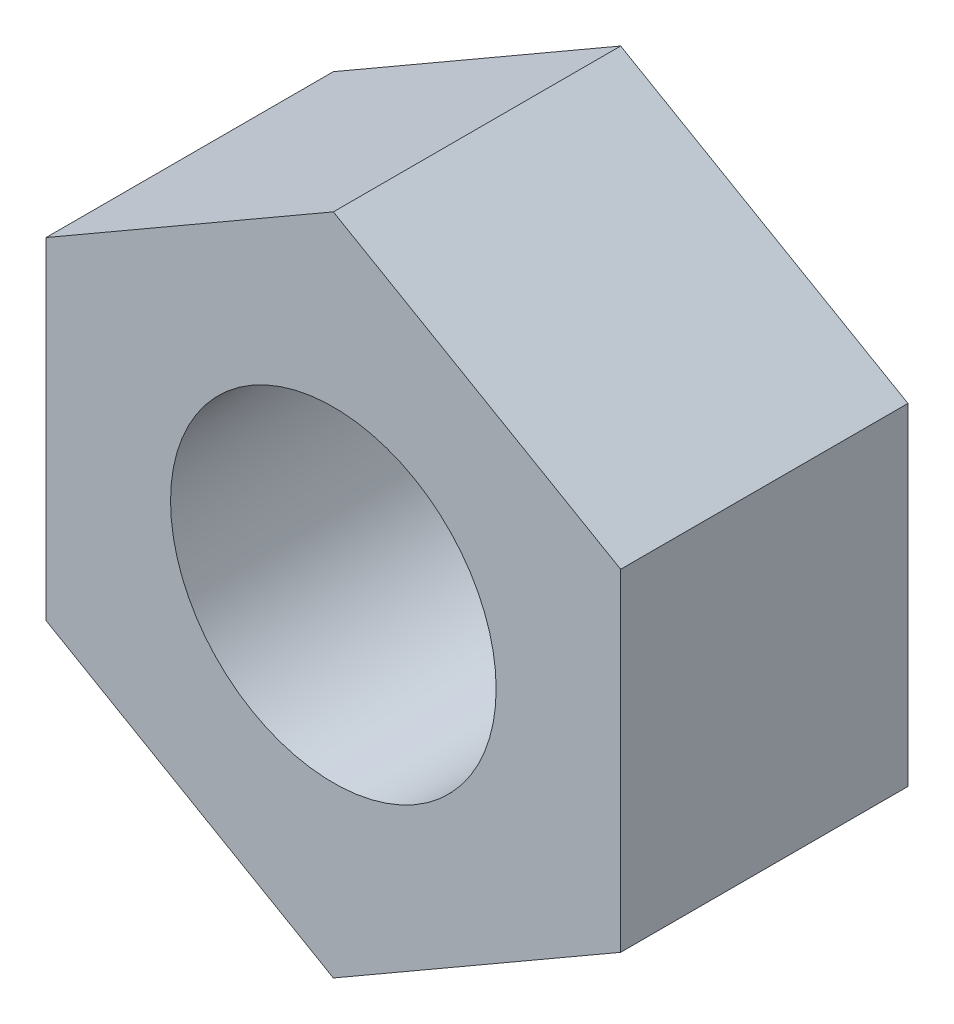
ISO-10303-21;
HEADER;
FILE_DESCRIPTION(('STEP AP214'),'2;1');
FILE_NAME('part.step','',(''),(''),'','','');
FILE_SCHEMA(('AUTOMOTIVE_DESIGN { 1 0 10303 214 1 1 1 1 }'));
ENDSEC;
DATA;
#1=APPLICATION_CONTEXT('core data for automotive mechanical design processes');
#2=APPLICATION_PROTOCOL_DEFINITION('international standard','automotive_design',2000,#1);
#3=PRODUCT_CONTEXT('',#1,'mechanical');
#4=PRODUCT('Part','Part','',(#3));
#5=PRODUCT_RELATED_PRODUCT_CATEGORY('part','',(#4));
#6=PRODUCT_DEFINITION_FORMATION('','',#4);
#7=PRODUCT_DEFINITION_CONTEXT('part definition',#1,'design');
#8=PRODUCT_DEFINITION('design','',#6,#7);
#9=PRODUCT_DEFINITION_SHAPE('','',#8);
#10=(LENGTH_UNIT() NAMED_UNIT(*) SI_UNIT(.MILLI.,.METRE.));
#11=(NAMED_UNIT(*) PLANE_ANGLE_UNIT() SI_UNIT($,.RADIAN.));
#12=(NAMED_UNIT(*) SI_UNIT($,.STERADIAN.) SOLID_ANGLE_UNIT());
#13=UNCERTAINTY_MEASURE_WITH_UNIT(LENGTH_MEASURE(1.E-05),#10,'distance_accuracy_value','');
#14=(GEOMETRIC_REPRESENTATION_CONTEXT(3) GLOBAL_UNCERTAINTY_ASSIGNED_CONTEXT((#13)) GLOBAL_UNIT_ASSIGNED_CONTEXT((#10,
#11,#12)) REPRESENTATION_CONTEXT('',''));
#15=CARTESIAN_POINT('',(0.,0.,0.));
#16=DIRECTION('',(0.,0.,1.));
#17=DIRECTION('',(1.,0.,0.));
#18=AXIS2_PLACEMENT_3D('',#15,#16,#17);
#19=CARTESIAN_POINT('',(0.,-6.92820323027551,6.));
#20=DIRECTION('',(-0.5,0.866025403784439,0.));
#21=DIRECTION('',(-0.866025403784439,-0.5,0.));
#22=AXIS2_PLACEMENT_3D('',#19,#20,#21);
#23=PLANE('',#22);
#24=DIRECTION('',(0.866025403784438,0.5,0.));
#25=VECTOR('',#24,1.);
#26=CARTESIAN_POINT('',(0.,-6.92820323027551,0.));
#27=LINE('',#26,#25);
#28=CARTESIAN_POINT('',(0.,-6.92820323027551,0.));
#29=VERTEX_POINT('',#28);
#30=CARTESIAN_POINT('',(6.,-3.46410161513775,0.));
#31=VERTEX_POINT('',#30);
#32=EDGE_CURVE('E138',#29,#31,#27,.T.);
#33=ORIENTED_EDGE('',*,*,#32,.T.);
#34=DIRECTION('',(0.,0.,-1.));
#35=VECTOR('',#34,1.);
#36=CARTESIAN_POINT('',(6.,-3.46410161513775,6.));
#37=LINE('',#36,#35);
#38=CARTESIAN_POINT('',(6.,-3.46410161513775,6.));
#39=VERTEX_POINT('',#38);
#40=EDGE_CURVE('E11',#39,#31,#37,.T.);
#41=ORIENTED_EDGE('',*,*,#40,.F.);
#42=DIRECTION('',(0.866025403784438,0.5,0.));
#43=VECTOR('',#42,1.);
#44=CARTESIAN_POINT('',(0.,-6.92820323027551,6.));
#45=LINE('',#44,#43);
#46=CARTESIAN_POINT('',(0.,-6.92820323027551,6.));
#47=VERTEX_POINT('',#46);
#48=EDGE_CURVE('E155',#47,#39,#45,.T.);
#49=ORIENTED_EDGE('',*,*,#48,.F.);
#50=DIRECTION('',(0.,0.,-1.));
#51=VECTOR('',#50,1.);
#52=CARTESIAN_POINT('',(0.,-6.92820323027551,6.));
#53=LINE('',#52,#51);
#54=EDGE_CURVE('E134',#47,#29,#53,.T.);
#55=ORIENTED_EDGE('',*,*,#54,.T.);
#56=EDGE_LOOP('',(#33,#41,#49,#55));
#57=FACE_BOUND('',#56,.T.);
#58=ADVANCED_FACE('F49',(#57),#23,.F.);
#59=CARTESIAN_POINT('',(6.,-3.46410161513775,6.));
#60=DIRECTION('',(-1.,0.,0.));
#61=DIRECTION('',(0.,0.,1.));
#62=AXIS2_PLACEMENT_3D('',#59,#60,#61);
#63=PLANE('',#62);
#64=DIRECTION('',(0.,1.,0.));
#65=VECTOR('',#64,1.);
#66=CARTESIAN_POINT('',(6.,-3.46410161513775,0.));
#67=LINE('',#66,#65);
#68=CARTESIAN_POINT('',(6.,3.46410161513776,0.));
#69=VERTEX_POINT('',#68);
#70=EDGE_CURVE('E142',#31,#69,#67,.T.);
#71=ORIENTED_EDGE('',*,*,#70,.T.);
#72=DIRECTION('',(0.,0.,-1.));
#73=VECTOR('',#72,1.);
#74=CARTESIAN_POINT('',(6.,3.46410161513776,6.));
#75=LINE('',#74,#73);
#76=CARTESIAN_POINT('',(6.,3.46410161513776,6.));
#77=VERTEX_POINT('',#76);
#78=EDGE_CURVE('E58',#77,#69,#75,.T.);
#79=ORIENTED_EDGE('',*,*,#78,.F.);
#80=DIRECTION('',(0.,1.,0.));
#81=VECTOR('',#80,1.);
#82=CARTESIAN_POINT('',(6.,-3.46410161513775,6.));
#83=LINE('',#82,#81);
#84=EDGE_CURVE('E103',#39,#77,#83,.T.);
#85=ORIENTED_EDGE('',*,*,#84,.F.);
#86=ORIENTED_EDGE('',*,*,#40,.T.);
#87=EDGE_LOOP('',(#71,#79,#85,#86));
#88=FACE_BOUND('',#87,.T.);
#89=ADVANCED_FACE('F185',(#88),#63,.F.);
#90=CARTESIAN_POINT('',(6.,3.46410161513776,6.));
#91=DIRECTION('',(-0.5,-0.866025403784439,0.));
#92=DIRECTION('',(0.866025403784439,-0.5,0.));
#93=AXIS2_PLACEMENT_3D('',#90,#91,#92);
#94=PLANE('',#93);
#95=DIRECTION('',(-0.866025403784439,0.5,0.));
#96=VECTOR('',#95,1.);
#97=CARTESIAN_POINT('',(6.,3.46410161513776,0.));
#98=LINE('',#97,#96);
#99=CARTESIAN_POINT('',(0.,6.92820323027551,0.));
#100=VERTEX_POINT('',#99);
#101=EDGE_CURVE('E146',#69,#100,#98,.T.);
#102=ORIENTED_EDGE('',*,*,#101,.T.);
#103=DIRECTION('',(0.,0.,-1.));
#104=VECTOR('',#103,1.);
#105=CARTESIAN_POINT('',(0.,6.92820323027551,6.));
#106=LINE('',#105,#104);
#107=CARTESIAN_POINT('',(0.,6.92820323027551,6.));
#108=VERTEX_POINT('',#107);
#109=EDGE_CURVE('E127',#108,#100,#106,.T.);
#110=ORIENTED_EDGE('',*,*,#109,.F.);
#111=DIRECTION('',(-0.866025403784439,0.5,0.));
#112=VECTOR('',#111,1.);
#113=CARTESIAN_POINT('',(6.,3.46410161513776,6.));
#114=LINE('',#113,#112);
#115=EDGE_CURVE('E116',#77,#108,#114,.T.);
#116=ORIENTED_EDGE('',*,*,#115,.F.);
#117=ORIENTED_EDGE('',*,*,#78,.T.);
#118=EDGE_LOOP('',(#102,#110,#116,#117));
#119=FACE_BOUND('',#118,.T.);
#120=ADVANCED_FACE('F165',(#119),#94,.F.);
#121=CARTESIAN_POINT('',(0.,6.92820323027551,6.));
#122=DIRECTION('',(0.5,-0.866025403784438,0.));
#123=DIRECTION('',(0.866025403784439,0.5,0.));
#124=AXIS2_PLACEMENT_3D('',#121,#122,#123);
#125=PLANE('',#124);
#126=DIRECTION('',(-0.866025403784439,-0.5,0.));
#127=VECTOR('',#126,1.);
#128=CARTESIAN_POINT('',(0.,6.92820323027551,0.));
#129=LINE('',#128,#127);
#130=CARTESIAN_POINT('',(-6.,3.46410161513775,0.));
#131=VERTEX_POINT('',#130);
#132=EDGE_CURVE('E125',#100,#131,#129,.T.);
#133=ORIENTED_EDGE('',*,*,#132,.T.);
#134=DIRECTION('',(0.,0.,-1.));
#135=VECTOR('',#134,1.);
#136=CARTESIAN_POINT('',(-6.,3.46410161513775,6.));
#137=LINE('',#136,#135);
#138=CARTESIAN_POINT('',(-6.,3.46410161513775,6.));
#139=VERTEX_POINT('',#138);
#140=EDGE_CURVE('E122',#139,#131,#137,.T.);
#141=ORIENTED_EDGE('',*,*,#140,.F.);
#142=DIRECTION('',(-0.866025403784439,-0.5,0.));
#143=VECTOR('',#142,1.);
#144=CARTESIAN_POINT('',(0.,6.92820323027551,6.));
#145=LINE('',#144,#143);
#146=EDGE_CURVE('E110',#108,#139,#145,.T.);
#147=ORIENTED_EDGE('',*,*,#146,.F.);
#148=ORIENTED_EDGE('',*,*,#109,.T.);
#149=EDGE_LOOP('',(#133,#141,#147,#148));
#150=FACE_BOUND('',#149,.T.);
#151=ADVANCED_FACE('F123',(#150),#125,.F.);
#152=CARTESIAN_POINT('',(-6.,3.46410161513775,6.));
#153=DIRECTION('',(1.,0.,0.));
#154=DIRECTION('',(0.,0.,-1.));
#155=AXIS2_PLACEMENT_3D('',#152,#153,#154);
#156=PLANE('',#155);
#157=DIRECTION('',(0.,-1.,0.));
#158=VECTOR('',#157,1.);
#159=CARTESIAN_POINT('',(-6.,3.46410161513775,0.));
#160=LINE('',#159,#158);
#161=CARTESIAN_POINT('',(-6.,-3.46410161513776,0.));
#162=VERTEX_POINT('',#161);
#163=EDGE_CURVE('E89',#131,#162,#160,.T.);
#164=ORIENTED_EDGE('',*,*,#163,.T.);
#165=DIRECTION('',(0.,0.,-1.));
#166=VECTOR('',#165,1.);
#167=CARTESIAN_POINT('',(-6.,-3.46410161513776,6.));
#168=LINE('',#167,#166);
#169=CARTESIAN_POINT('',(-6.,-3.46410161513776,6.));
#170=VERTEX_POINT('',#169);
#171=EDGE_CURVE('E128',#170,#162,#168,.T.);
#172=ORIENTED_EDGE('',*,*,#171,.F.);
#173=DIRECTION('',(0.,-1.,0.));
#174=VECTOR('',#173,1.);
#175=CARTESIAN_POINT('',(-6.,3.46410161513775,6.));
#176=LINE('',#175,#174);
#177=EDGE_CURVE('E114',#139,#170,#176,.T.);
#178=ORIENTED_EDGE('',*,*,#177,.F.);
#179=ORIENTED_EDGE('',*,*,#140,.T.);
#180=EDGE_LOOP('',(#164,#172,#178,#179));
#181=FACE_BOUND('',#180,.T.);
#182=ADVANCED_FACE('F130',(#181),#156,.F.);
#183=CARTESIAN_POINT('',(-6.,-3.46410161513776,6.));
#184=DIRECTION('',(0.5,0.866025403784439,0.));
#185=DIRECTION('',(-0.866025403784439,0.5,0.));
#186=AXIS2_PLACEMENT_3D('',#183,#184,#185);
#187=PLANE('',#186);
#188=DIRECTION('',(0.866025403784439,-0.5,0.));
#189=VECTOR('',#188,1.);
#190=CARTESIAN_POINT('',(-6.,-3.46410161513776,0.));
#191=LINE('',#190,#189);
#192=EDGE_CURVE('E95',#162,#29,#191,.T.);
#193=ORIENTED_EDGE('',*,*,#192,.T.);
#194=ORIENTED_EDGE('',*,*,#54,.F.);
#195=DIRECTION('',(0.866025403784439,-0.5,0.));
#196=VECTOR('',#195,1.);
#197=CARTESIAN_POINT('',(-6.,-3.46410161513776,6.));
#198=LINE('',#197,#196);
#199=EDGE_CURVE('E66',#170,#47,#198,.T.);
#200=ORIENTED_EDGE('',*,*,#199,.F.);
#201=ORIENTED_EDGE('',*,*,#171,.T.);
#202=EDGE_LOOP('',(#193,#194,#200,#201));
#203=FACE_BOUND('',#202,.T.);
#204=ADVANCED_FACE('F172',(#203),#187,.F.);
#205=CARTESIAN_POINT('',(0.,0.,6.));
#206=DIRECTION('',(0.,0.,1.));
#207=DIRECTION('',(1.,0.,0.));
#208=AXIS2_PLACEMENT_3D('',#205,#206,#207);
#209=PLANE('',#208);
#210=CARTESIAN_POINT('',(0.,0.,6.));
#211=DIRECTION('',(0.,0.,1.));
#212=DIRECTION('',(1.,0.,0.));
#213=AXIS2_PLACEMENT_3D('',#210,#211,#212);
#214=CIRCLE('',#213,3.39999999999999);
#215=CARTESIAN_POINT('',(3.39999999999999,0.,6.));
#216=VERTEX_POINT('',#215);
#217=EDGE_CURVE('E265',#216,#216,#214,.T.);
#218=ORIENTED_EDGE('',*,*,#217,.F.);
#219=EDGE_LOOP('',(#218));
#220=FACE_BOUND('',#219,.T.);
#221=ORIENTED_EDGE('',*,*,#48,.T.);
#222=ORIENTED_EDGE('',*,*,#84,.T.);
#223=ORIENTED_EDGE('',*,*,#115,.T.);
#224=ORIENTED_EDGE('',*,*,#146,.T.);
#225=ORIENTED_EDGE('',*,*,#177,.T.);
#226=ORIENTED_EDGE('',*,*,#199,.T.);
#227=EDGE_LOOP('',(#221,#222,#223,#224,#225,#226));
#228=FACE_BOUND('',#227,.T.);
#229=ADVANCED_FACE('F112',(#220,#228),#209,.T.);
#230=CARTESIAN_POINT('',(0.,0.,0.));
#231=DIRECTION('',(0.,0.,1.));
#232=DIRECTION('',(1.,0.,0.));
#233=AXIS2_PLACEMENT_3D('',#230,#231,#232);
#234=PLANE('',#233);
#235=CARTESIAN_POINT('',(0.,0.,0.));
#236=DIRECTION('',(0.,0.,1.));
#237=DIRECTION('',(1.,0.,0.));
#238=AXIS2_PLACEMENT_3D('',#235,#236,#237);
#239=CIRCLE('',#238,3.4);
#240=CARTESIAN_POINT('',(3.4,0.,0.));
#241=VERTEX_POINT('',#240);
#242=EDGE_CURVE('E143',#241,#241,#239,.T.);
#243=ORIENTED_EDGE('',*,*,#242,.T.);
#244=EDGE_LOOP('',(#243));
#245=FACE_BOUND('',#244,.T.);
#246=ORIENTED_EDGE('',*,*,#32,.F.);
#247=ORIENTED_EDGE('',*,*,#192,.F.);
#248=ORIENTED_EDGE('',*,*,#163,.F.);
#249=ORIENTED_EDGE('',*,*,#132,.F.);
#250=ORIENTED_EDGE('',*,*,#101,.F.);
#251=ORIENTED_EDGE('',*,*,#70,.F.);
#252=EDGE_LOOP('',(#246,#247,#248,#249,#250,#251));
#253=FACE_BOUND('',#252,.T.);
#254=ADVANCED_FACE('F168',(#245,#253),#234,.F.);
#255=CARTESIAN_POINT('',(0.,0.,6.));
#256=DIRECTION('',(0.,0.,1.));
#257=DIRECTION('',(1.,0.,0.));
#258=AXIS2_PLACEMENT_3D('',#255,#256,#257);
#259=CYLINDRICAL_SURFACE('',#258,3.39999999999999);
#260=ORIENTED_EDGE('',*,*,#242,.F.);
#261=EDGE_LOOP('',(#260));
#262=FACE_BOUND('',#261,.T.);
#263=ORIENTED_EDGE('',*,*,#217,.T.);
#264=EDGE_LOOP('',(#263));
#265=FACE_BOUND('',#264,.T.);
#266=ADVANCED_FACE('F224',(#262,#265),#259,.F.);
#267=CLOSED_SHELL('',(#58,#89,#120,#151,#182,#204,#229,#254,#266));
#268=MANIFOLD_SOLID_BREP('B2',#267);
#269=ADVANCED_BREP_SHAPE_REPRESENTATION('',(#18,#268),#14);
#270=SHAPE_DEFINITION_REPRESENTATION(#9,#269);
ENDSEC;
END-ISO-10303-21;
